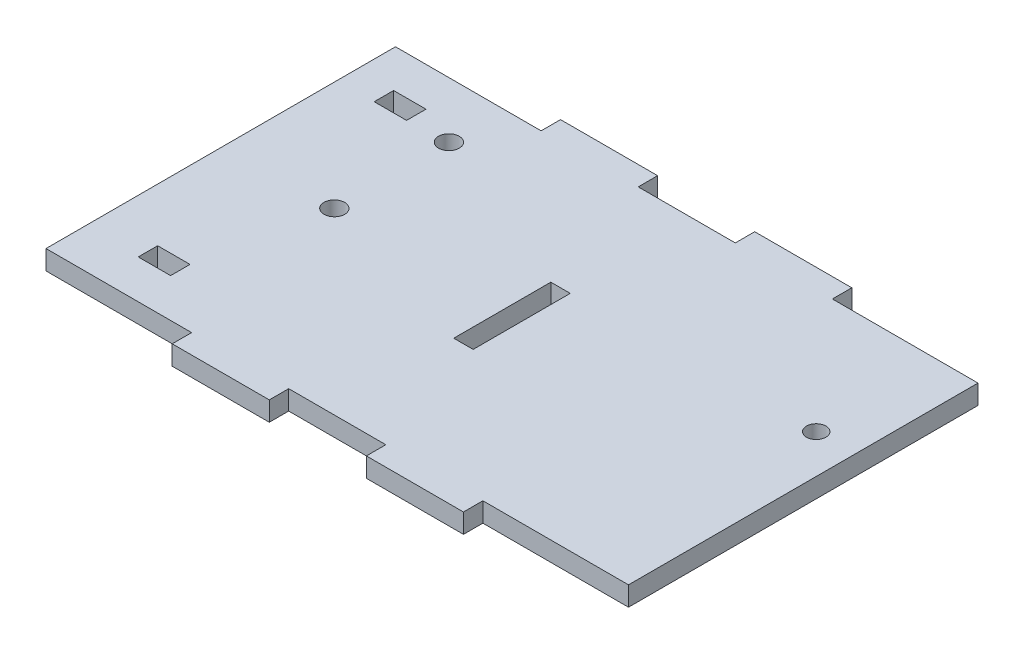
ISO-10303-21;
HEADER;
FILE_DESCRIPTION(('STEP AP214'),'2;1');
FILE_NAME('part.step','',(''),(''),'','','');
FILE_SCHEMA(('AUTOMOTIVE_DESIGN { 1 0 10303 214 1 1 1 1 }'));
ENDSEC;
DATA;
#1=APPLICATION_CONTEXT('core data for automotive mechanical design processes');
#2=APPLICATION_PROTOCOL_DEFINITION('international standard','automotive_design',2000,#1);
#3=PRODUCT_CONTEXT('',#1,'mechanical');
#4=PRODUCT('Part','Part','',(#3));
#5=PRODUCT_RELATED_PRODUCT_CATEGORY('part','',(#4));
#6=PRODUCT_DEFINITION_FORMATION('','',#4);
#7=PRODUCT_DEFINITION_CONTEXT('part definition',#1,'design');
#8=PRODUCT_DEFINITION('design','',#6,#7);
#9=PRODUCT_DEFINITION_SHAPE('','',#8);
#10=(LENGTH_UNIT() NAMED_UNIT(*) SI_UNIT(.MILLI.,.METRE.));
#11=(NAMED_UNIT(*) PLANE_ANGLE_UNIT() SI_UNIT($,.RADIAN.));
#12=(NAMED_UNIT(*) SI_UNIT($,.STERADIAN.) SOLID_ANGLE_UNIT());
#13=UNCERTAINTY_MEASURE_WITH_UNIT(LENGTH_MEASURE(1.E-05),#10,'distance_accuracy_value','');
#14=(GEOMETRIC_REPRESENTATION_CONTEXT(3) GLOBAL_UNCERTAINTY_ASSIGNED_CONTEXT((#13)) GLOBAL_UNIT_ASSIGNED_CONTEXT((#10,
#11,#12)) REPRESENTATION_CONTEXT('',''));
#15=CARTESIAN_POINT('',(0.,0.,0.));
#16=DIRECTION('',(0.,0.,1.));
#17=DIRECTION('',(1.,0.,0.));
#18=AXIS2_PLACEMENT_3D('',#15,#16,#17);
#19=CARTESIAN_POINT('',(-44.9999999999999,3.,27.0000000000001));
#20=DIRECTION('',(1.,0.,0.));
#21=DIRECTION('',(0.,0.,-1.));
#22=AXIS2_PLACEMENT_3D('',#19,#20,#21);
#23=PLANE('',#22);
#24=DIRECTION('',(0.,0.,1.));
#25=VECTOR('',#24,1.);
#26=CARTESIAN_POINT('',(-44.9999999999999,0.,27.0000000000001));
#27=LINE('',#26,#25);
#28=CARTESIAN_POINT('',(-44.9999999999999,0.,-27.));
#29=VERTEX_POINT('',#28);
#30=CARTESIAN_POINT('',(-44.9999999999999,0.,27.0000000000001));
#31=VERTEX_POINT('',#30);
#32=EDGE_CURVE('E338',#29,#31,#27,.T.);
#33=ORIENTED_EDGE('',*,*,#32,.T.);
#34=DIRECTION('',(0.,-1.,0.));
#35=VECTOR('',#34,1.);
#36=CARTESIAN_POINT('',(-44.9999999999999,3.,27.0000000000001));
#37=LINE('',#36,#35);
#38=CARTESIAN_POINT('',(-44.9999999999999,3.,27.0000000000001));
#39=VERTEX_POINT('',#38);
#40=EDGE_CURVE('E11',#39,#31,#37,.T.);
#41=ORIENTED_EDGE('',*,*,#40,.F.);
#42=DIRECTION('',(0.,0.,1.));
#43=VECTOR('',#42,1.);
#44=CARTESIAN_POINT('',(-44.9999999999999,3.,27.0000000000001));
#45=LINE('',#44,#43);
#46=CARTESIAN_POINT('',(-44.9999999999999,3.,-27.));
#47=VERTEX_POINT('',#46);
#48=EDGE_CURVE('E345',#47,#39,#45,.T.);
#49=ORIENTED_EDGE('',*,*,#48,.F.);
#50=DIRECTION('',(0.,-1.,0.));
#51=VECTOR('',#50,1.);
#52=CARTESIAN_POINT('',(-44.9999999999999,3.,-27.));
#53=LINE('',#52,#51);
#54=EDGE_CURVE('E387',#47,#29,#53,.T.);
#55=ORIENTED_EDGE('',*,*,#54,.T.);
#56=EDGE_LOOP('',(#33,#41,#49,#55));
#57=FACE_BOUND('',#56,.T.);
#58=ADVANCED_FACE('F32',(#57),#23,.F.);
#59=CARTESIAN_POINT('',(-22.5,3.,27.0000000000001));
#60=DIRECTION('',(0.,0.,-1.));
#61=DIRECTION('',(-1.,0.,0.));
#62=AXIS2_PLACEMENT_3D('',#59,#60,#61);
#63=PLANE('',#62);
#64=DIRECTION('',(1.,0.,0.));
#65=VECTOR('',#64,1.);
#66=CARTESIAN_POINT('',(-22.5,0.,27.0000000000001));
#67=LINE('',#66,#65);
#68=CARTESIAN_POINT('',(-22.5,0.,27.0000000000001));
#69=VERTEX_POINT('',#68);
#70=EDGE_CURVE('E390',#31,#69,#67,.T.);
#71=ORIENTED_EDGE('',*,*,#70,.T.);
#72=DIRECTION('',(0.,-1.,0.));
#73=VECTOR('',#72,1.);
#74=CARTESIAN_POINT('',(-22.5,3.,27.0000000000001));
#75=LINE('',#74,#73);
#76=CARTESIAN_POINT('',(-22.5,3.,27.0000000000001));
#77=VERTEX_POINT('',#76);
#78=EDGE_CURVE('E39',#77,#69,#75,.T.);
#79=ORIENTED_EDGE('',*,*,#78,.F.);
#80=DIRECTION('',(1.,0.,0.));
#81=VECTOR('',#80,1.);
#82=CARTESIAN_POINT('',(-22.5,3.,27.0000000000001));
#83=LINE('',#82,#81);
#84=EDGE_CURVE('E348',#39,#77,#83,.T.);
#85=ORIENTED_EDGE('',*,*,#84,.F.);
#86=ORIENTED_EDGE('',*,*,#40,.T.);
#87=EDGE_LOOP('',(#71,#79,#85,#86));
#88=FACE_BOUND('',#87,.T.);
#89=ADVANCED_FACE('F506',(#88),#63,.F.);
#90=CARTESIAN_POINT('',(-22.5,3.,30.0000000000002));
#91=DIRECTION('',(1.,0.,0.));
#92=DIRECTION('',(0.,0.,-1.));
#93=AXIS2_PLACEMENT_3D('',#90,#91,#92);
#94=PLANE('',#93);
#95=DIRECTION('',(0.,0.,1.));
#96=VECTOR('',#95,1.);
#97=CARTESIAN_POINT('',(-22.5,0.,30.0000000000002));
#98=LINE('',#97,#96);
#99=CARTESIAN_POINT('',(-22.5,0.,30.0000000000002));
#100=VERTEX_POINT('',#99);
#101=EDGE_CURVE('E392',#69,#100,#98,.T.);
#102=ORIENTED_EDGE('',*,*,#101,.T.);
#103=DIRECTION('',(0.,-1.,0.));
#104=VECTOR('',#103,1.);
#105=CARTESIAN_POINT('',(-22.5,3.,30.0000000000002));
#106=LINE('',#105,#104);
#107=CARTESIAN_POINT('',(-22.5,3.,30.0000000000002));
#108=VERTEX_POINT('',#107);
#109=EDGE_CURVE('E477',#108,#100,#106,.T.);
#110=ORIENTED_EDGE('',*,*,#109,.F.);
#111=DIRECTION('',(0.,0.,1.));
#112=VECTOR('',#111,1.);
#113=CARTESIAN_POINT('',(-22.5,3.,30.0000000000002));
#114=LINE('',#113,#112);
#115=EDGE_CURVE('E351',#77,#108,#114,.T.);
#116=ORIENTED_EDGE('',*,*,#115,.F.);
#117=ORIENTED_EDGE('',*,*,#78,.T.);
#118=EDGE_LOOP('',(#102,#110,#116,#117));
#119=FACE_BOUND('',#118,.T.);
#120=ADVANCED_FACE('F484',(#119),#94,.F.);
#121=CARTESIAN_POINT('',(-7.49999999999984,3.,30.0000000000001));
#122=DIRECTION('',(0.,0.,-1.));
#123=DIRECTION('',(-1.,0.,0.));
#124=AXIS2_PLACEMENT_3D('',#121,#122,#123);
#125=PLANE('',#124);
#126=DIRECTION('',(1.,0.,0.));
#127=VECTOR('',#126,1.);
#128=CARTESIAN_POINT('',(-7.49999999999984,0.,30.0000000000001));
#129=LINE('',#128,#127);
#130=CARTESIAN_POINT('',(-7.49999999999984,0.,30.0000000000001));
#131=VERTEX_POINT('',#130);
#132=EDGE_CURVE('E394',#100,#131,#129,.T.);
#133=ORIENTED_EDGE('',*,*,#132,.T.);
#134=DIRECTION('',(0.,-1.,0.));
#135=VECTOR('',#134,1.);
#136=CARTESIAN_POINT('',(-7.49999999999984,3.,30.0000000000001));
#137=LINE('',#136,#135);
#138=CARTESIAN_POINT('',(-7.49999999999984,3.,30.0000000000001));
#139=VERTEX_POINT('',#138);
#140=EDGE_CURVE('E474',#139,#131,#137,.T.);
#141=ORIENTED_EDGE('',*,*,#140,.F.);
#142=DIRECTION('',(1.,0.,0.));
#143=VECTOR('',#142,1.);
#144=CARTESIAN_POINT('',(-7.49999999999984,3.,30.0000000000001));
#145=LINE('',#144,#143);
#146=EDGE_CURVE('E353',#108,#139,#145,.T.);
#147=ORIENTED_EDGE('',*,*,#146,.F.);
#148=ORIENTED_EDGE('',*,*,#109,.T.);
#149=EDGE_LOOP('',(#133,#141,#147,#148));
#150=FACE_BOUND('',#149,.T.);
#151=ADVANCED_FACE('F494',(#150),#125,.F.);
#152=CARTESIAN_POINT('',(-7.49999999999984,3.,27.0000000000001));
#153=DIRECTION('',(-1.,0.,0.));
#154=DIRECTION('',(0.,0.,1.));
#155=AXIS2_PLACEMENT_3D('',#152,#153,#154);
#156=PLANE('',#155);
#157=DIRECTION('',(0.,0.,-1.));
#158=VECTOR('',#157,1.);
#159=CARTESIAN_POINT('',(-7.49999999999984,0.,27.0000000000001));
#160=LINE('',#159,#158);
#161=CARTESIAN_POINT('',(-7.49999999999984,0.,27.0000000000001));
#162=VERTEX_POINT('',#161);
#163=EDGE_CURVE('E396',#131,#162,#160,.T.);
#164=ORIENTED_EDGE('',*,*,#163,.T.);
#165=DIRECTION('',(0.,-1.,0.));
#166=VECTOR('',#165,1.);
#167=CARTESIAN_POINT('',(-7.49999999999984,3.,27.0000000000001));
#168=LINE('',#167,#166);
#169=CARTESIAN_POINT('',(-7.49999999999984,3.,27.0000000000001));
#170=VERTEX_POINT('',#169);
#171=EDGE_CURVE('E471',#170,#162,#168,.T.);
#172=ORIENTED_EDGE('',*,*,#171,.F.);
#173=DIRECTION('',(0.,0.,-1.));
#174=VECTOR('',#173,1.);
#175=CARTESIAN_POINT('',(-7.49999999999984,3.,27.0000000000001));
#176=LINE('',#175,#174);
#177=EDGE_CURVE('E355',#139,#170,#176,.T.);
#178=ORIENTED_EDGE('',*,*,#177,.F.);
#179=ORIENTED_EDGE('',*,*,#140,.T.);
#180=EDGE_LOOP('',(#164,#172,#178,#179));
#181=FACE_BOUND('',#180,.T.);
#182=ADVANCED_FACE('F498',(#181),#156,.F.);
#183=CARTESIAN_POINT('',(7.50000000000028,3.,27.));
#184=DIRECTION('',(0.,0.,-1.));
#185=DIRECTION('',(-1.,0.,0.));
#186=AXIS2_PLACEMENT_3D('',#183,#184,#185);
#187=PLANE('',#186);
#188=DIRECTION('',(1.,0.,0.));
#189=VECTOR('',#188,1.);
#190=CARTESIAN_POINT('',(7.50000000000028,0.,27.));
#191=LINE('',#190,#189);
#192=CARTESIAN_POINT('',(7.50000000000028,0.,27.));
#193=VERTEX_POINT('',#192);
#194=EDGE_CURVE('E398',#162,#193,#191,.T.);
#195=ORIENTED_EDGE('',*,*,#194,.T.);
#196=DIRECTION('',(0.,-1.,0.));
#197=VECTOR('',#196,1.);
#198=CARTESIAN_POINT('',(7.50000000000028,3.,27.));
#199=LINE('',#198,#197);
#200=CARTESIAN_POINT('',(7.50000000000028,3.,27.));
#201=VERTEX_POINT('',#200);
#202=EDGE_CURVE('E468',#201,#193,#199,.T.);
#203=ORIENTED_EDGE('',*,*,#202,.F.);
#204=DIRECTION('',(1.,0.,0.));
#205=VECTOR('',#204,1.);
#206=CARTESIAN_POINT('',(7.50000000000028,3.,27.));
#207=LINE('',#206,#205);
#208=EDGE_CURVE('E357',#170,#201,#207,.T.);
#209=ORIENTED_EDGE('',*,*,#208,.F.);
#210=ORIENTED_EDGE('',*,*,#171,.T.);
#211=EDGE_LOOP('',(#195,#203,#209,#210));
#212=FACE_BOUND('',#211,.T.);
#213=ADVANCED_FACE('F579',(#212),#187,.F.);
#214=CARTESIAN_POINT('',(7.50000000000028,3.,30.0000000000001));
#215=DIRECTION('',(1.,0.,0.));
#216=DIRECTION('',(0.,0.,-1.));
#217=AXIS2_PLACEMENT_3D('',#214,#215,#216);
#218=PLANE('',#217);
#219=DIRECTION('',(0.,0.,1.));
#220=VECTOR('',#219,1.);
#221=CARTESIAN_POINT('',(7.50000000000028,0.,30.0000000000001));
#222=LINE('',#221,#220);
#223=CARTESIAN_POINT('',(7.50000000000028,0.,30.0000000000001));
#224=VERTEX_POINT('',#223);
#225=EDGE_CURVE('E400',#193,#224,#222,.T.);
#226=ORIENTED_EDGE('',*,*,#225,.T.);
#227=DIRECTION('',(0.,-1.,0.));
#228=VECTOR('',#227,1.);
#229=CARTESIAN_POINT('',(7.50000000000028,3.,30.0000000000001));
#230=LINE('',#229,#228);
#231=CARTESIAN_POINT('',(7.50000000000028,3.,30.0000000000001));
#232=VERTEX_POINT('',#231);
#233=EDGE_CURVE('E465',#232,#224,#230,.T.);
#234=ORIENTED_EDGE('',*,*,#233,.F.);
#235=DIRECTION('',(0.,0.,1.));
#236=VECTOR('',#235,1.);
#237=CARTESIAN_POINT('',(7.50000000000028,3.,30.0000000000001));
#238=LINE('',#237,#236);
#239=EDGE_CURVE('E359',#201,#232,#238,.T.);
#240=ORIENTED_EDGE('',*,*,#239,.F.);
#241=ORIENTED_EDGE('',*,*,#202,.T.);
#242=EDGE_LOOP('',(#226,#234,#240,#241));
#243=FACE_BOUND('',#242,.T.);
#244=ADVANCED_FACE('F577',(#243),#218,.F.);
#245=CARTESIAN_POINT('',(22.5000000000002,3.,30.0000000000001));
#246=DIRECTION('',(0.,0.,-1.));
#247=DIRECTION('',(-1.,0.,0.));
#248=AXIS2_PLACEMENT_3D('',#245,#246,#247);
#249=PLANE('',#248);
#250=DIRECTION('',(1.,0.,0.));
#251=VECTOR('',#250,1.);
#252=CARTESIAN_POINT('',(22.5000000000002,0.,30.0000000000001));
#253=LINE('',#252,#251);
#254=CARTESIAN_POINT('',(22.5000000000002,0.,30.0000000000001));
#255=VERTEX_POINT('',#254);
#256=EDGE_CURVE('E402',#224,#255,#253,.T.);
#257=ORIENTED_EDGE('',*,*,#256,.T.);
#258=DIRECTION('',(0.,-1.,0.));
#259=VECTOR('',#258,1.);
#260=CARTESIAN_POINT('',(22.5000000000002,3.,30.0000000000001));
#261=LINE('',#260,#259);
#262=CARTESIAN_POINT('',(22.5000000000002,3.,30.0000000000001));
#263=VERTEX_POINT('',#262);
#264=EDGE_CURVE('E462',#263,#255,#261,.T.);
#265=ORIENTED_EDGE('',*,*,#264,.F.);
#266=DIRECTION('',(1.,0.,0.));
#267=VECTOR('',#266,1.);
#268=CARTESIAN_POINT('',(22.5000000000002,3.,30.0000000000001));
#269=LINE('',#268,#267);
#270=EDGE_CURVE('E361',#232,#263,#269,.T.);
#271=ORIENTED_EDGE('',*,*,#270,.F.);
#272=ORIENTED_EDGE('',*,*,#233,.T.);
#273=EDGE_LOOP('',(#257,#265,#271,#272));
#274=FACE_BOUND('',#273,.T.);
#275=ADVANCED_FACE('F572',(#274),#249,.F.);
#276=CARTESIAN_POINT('',(22.5000000000002,3.,27.0000000000001));
#277=DIRECTION('',(-1.,0.,0.));
#278=DIRECTION('',(0.,0.,1.));
#279=AXIS2_PLACEMENT_3D('',#276,#277,#278);
#280=PLANE('',#279);
#281=DIRECTION('',(0.,0.,-1.));
#282=VECTOR('',#281,1.);
#283=CARTESIAN_POINT('',(22.5000000000002,0.,27.0000000000001));
#284=LINE('',#283,#282);
#285=CARTESIAN_POINT('',(22.5000000000002,0.,27.0000000000001));
#286=VERTEX_POINT('',#285);
#287=EDGE_CURVE('E404',#255,#286,#284,.T.);
#288=ORIENTED_EDGE('',*,*,#287,.T.);
#289=DIRECTION('',(0.,-1.,0.));
#290=VECTOR('',#289,1.);
#291=CARTESIAN_POINT('',(22.5000000000002,3.,27.0000000000001));
#292=LINE('',#291,#290);
#293=CARTESIAN_POINT('',(22.5000000000002,3.,27.0000000000001));
#294=VERTEX_POINT('',#293);
#295=EDGE_CURVE('E459',#294,#286,#292,.T.);
#296=ORIENTED_EDGE('',*,*,#295,.F.);
#297=DIRECTION('',(0.,0.,-1.));
#298=VECTOR('',#297,1.);
#299=CARTESIAN_POINT('',(22.5000000000002,3.,27.0000000000001));
#300=LINE('',#299,#298);
#301=EDGE_CURVE('E363',#263,#294,#300,.T.);
#302=ORIENTED_EDGE('',*,*,#301,.F.);
#303=ORIENTED_EDGE('',*,*,#264,.T.);
#304=EDGE_LOOP('',(#288,#296,#302,#303));
#305=FACE_BOUND('',#304,.T.);
#306=ADVANCED_FACE('F567',(#305),#280,.F.);
#307=CARTESIAN_POINT('',(45.0000000000004,3.,27.));
#308=DIRECTION('',(0.,0.,-1.));
#309=DIRECTION('',(-1.,0.,0.));
#310=AXIS2_PLACEMENT_3D('',#307,#308,#309);
#311=PLANE('',#310);
#312=DIRECTION('',(1.,0.,0.));
#313=VECTOR('',#312,1.);
#314=CARTESIAN_POINT('',(45.0000000000004,0.,27.));
#315=LINE('',#314,#313);
#316=CARTESIAN_POINT('',(45.0000000000004,0.,27.));
#317=VERTEX_POINT('',#316);
#318=EDGE_CURVE('E406',#286,#317,#315,.T.);
#319=ORIENTED_EDGE('',*,*,#318,.T.);
#320=DIRECTION('',(0.,-1.,0.));
#321=VECTOR('',#320,1.);
#322=CARTESIAN_POINT('',(45.0000000000004,3.,27.));
#323=LINE('',#322,#321);
#324=CARTESIAN_POINT('',(45.0000000000004,3.,27.));
#325=VERTEX_POINT('',#324);
#326=EDGE_CURVE('E456',#325,#317,#323,.T.);
#327=ORIENTED_EDGE('',*,*,#326,.F.);
#328=DIRECTION('',(1.,0.,0.));
#329=VECTOR('',#328,1.);
#330=CARTESIAN_POINT('',(45.0000000000004,3.,27.));
#331=LINE('',#330,#329);
#332=EDGE_CURVE('E365',#294,#325,#331,.T.);
#333=ORIENTED_EDGE('',*,*,#332,.F.);
#334=ORIENTED_EDGE('',*,*,#295,.T.);
#335=EDGE_LOOP('',(#319,#327,#333,#334));
#336=FACE_BOUND('',#335,.T.);
#337=ADVANCED_FACE('F563',(#336),#311,.F.);
#338=CARTESIAN_POINT('',(44.9999999999997,3.,-27.0000000000001));
#339=DIRECTION('',(-1.,0.,0.));
#340=DIRECTION('',(0.,0.,1.));
#341=AXIS2_PLACEMENT_3D('',#338,#339,#340);
#342=PLANE('',#341);
#343=DIRECTION('',(0.,0.,-1.));
#344=VECTOR('',#343,1.);
#345=CARTESIAN_POINT('',(44.9999999999997,0.,-27.0000000000001));
#346=LINE('',#345,#344);
#347=CARTESIAN_POINT('',(44.9999999999997,0.,-27.0000000000001));
#348=VERTEX_POINT('',#347);
#349=EDGE_CURVE('E408',#317,#348,#346,.T.);
#350=ORIENTED_EDGE('',*,*,#349,.T.);
#351=DIRECTION('',(0.,-1.,0.));
#352=VECTOR('',#351,1.);
#353=CARTESIAN_POINT('',(44.9999999999997,3.,-27.0000000000001));
#354=LINE('',#353,#352);
#355=CARTESIAN_POINT('',(44.9999999999997,3.,-27.0000000000001));
#356=VERTEX_POINT('',#355);
#357=EDGE_CURVE('E453',#356,#348,#354,.T.);
#358=ORIENTED_EDGE('',*,*,#357,.F.);
#359=DIRECTION('',(0.,0.,-1.));
#360=VECTOR('',#359,1.);
#361=CARTESIAN_POINT('',(44.9999999999997,3.,-27.0000000000001));
#362=LINE('',#361,#360);
#363=EDGE_CURVE('E367',#325,#356,#362,.T.);
#364=ORIENTED_EDGE('',*,*,#363,.F.);
#365=ORIENTED_EDGE('',*,*,#326,.T.);
#366=EDGE_LOOP('',(#350,#358,#364,#365));
#367=FACE_BOUND('',#366,.T.);
#368=ADVANCED_FACE('F558',(#367),#342,.F.);
#369=CARTESIAN_POINT('',(22.5,3.,-27.0000000000001));
#370=DIRECTION('',(0.,0.,1.));
#371=DIRECTION('',(1.,0.,0.));
#372=AXIS2_PLACEMENT_3D('',#369,#370,#371);
#373=PLANE('',#372);
#374=DIRECTION('',(-1.,0.,0.));
#375=VECTOR('',#374,1.);
#376=CARTESIAN_POINT('',(22.5,0.,-27.0000000000001));
#377=LINE('',#376,#375);
#378=CARTESIAN_POINT('',(22.5,0.,-27.0000000000001));
#379=VERTEX_POINT('',#378);
#380=EDGE_CURVE('E410',#348,#379,#377,.T.);
#381=ORIENTED_EDGE('',*,*,#380,.T.);
#382=DIRECTION('',(0.,-1.,0.));
#383=VECTOR('',#382,1.);
#384=CARTESIAN_POINT('',(22.5,3.,-27.0000000000001));
#385=LINE('',#384,#383);
#386=CARTESIAN_POINT('',(22.5,3.,-27.0000000000001));
#387=VERTEX_POINT('',#386);
#388=EDGE_CURVE('E450',#387,#379,#385,.T.);
#389=ORIENTED_EDGE('',*,*,#388,.F.);
#390=DIRECTION('',(-1.,0.,0.));
#391=VECTOR('',#390,1.);
#392=CARTESIAN_POINT('',(22.5,3.,-27.0000000000001));
#393=LINE('',#392,#391);
#394=EDGE_CURVE('E369',#356,#387,#393,.T.);
#395=ORIENTED_EDGE('',*,*,#394,.F.);
#396=ORIENTED_EDGE('',*,*,#357,.T.);
#397=EDGE_LOOP('',(#381,#389,#395,#396));
#398=FACE_BOUND('',#397,.T.);
#399=ADVANCED_FACE('F552',(#398),#373,.F.);
#400=CARTESIAN_POINT('',(22.5,3.,-30.0000000000001));
#401=DIRECTION('',(-1.,0.,0.));
#402=DIRECTION('',(0.,0.,1.));
#403=AXIS2_PLACEMENT_3D('',#400,#401,#402);
#404=PLANE('',#403);
#405=DIRECTION('',(0.,0.,-1.));
#406=VECTOR('',#405,1.);
#407=CARTESIAN_POINT('',(22.5,0.,-30.0000000000001));
#408=LINE('',#407,#406);
#409=CARTESIAN_POINT('',(22.5,0.,-30.0000000000001));
#410=VERTEX_POINT('',#409);
#411=EDGE_CURVE('E412',#379,#410,#408,.T.);
#412=ORIENTED_EDGE('',*,*,#411,.T.);
#413=DIRECTION('',(0.,-1.,0.));
#414=VECTOR('',#413,1.);
#415=CARTESIAN_POINT('',(22.5,3.,-30.0000000000001));
#416=LINE('',#415,#414);
#417=CARTESIAN_POINT('',(22.5,3.,-30.0000000000001));
#418=VERTEX_POINT('',#417);
#419=EDGE_CURVE('E447',#418,#410,#416,.T.);
#420=ORIENTED_EDGE('',*,*,#419,.F.);
#421=DIRECTION('',(0.,0.,-1.));
#422=VECTOR('',#421,1.);
#423=CARTESIAN_POINT('',(22.5,3.,-30.0000000000001));
#424=LINE('',#423,#422);
#425=EDGE_CURVE('E371',#387,#418,#424,.T.);
#426=ORIENTED_EDGE('',*,*,#425,.F.);
#427=ORIENTED_EDGE('',*,*,#388,.T.);
#428=EDGE_LOOP('',(#412,#420,#426,#427));
#429=FACE_BOUND('',#428,.T.);
#430=ADVANCED_FACE('F548',(#429),#404,.F.);
#431=CARTESIAN_POINT('',(7.50000000000006,3.,-30.0000000000001));
#432=DIRECTION('',(0.,0.,1.));
#433=DIRECTION('',(1.,0.,0.));
#434=AXIS2_PLACEMENT_3D('',#431,#432,#433);
#435=PLANE('',#434);
#436=DIRECTION('',(-1.,0.,0.));
#437=VECTOR('',#436,1.);
#438=CARTESIAN_POINT('',(7.50000000000006,0.,-30.0000000000001));
#439=LINE('',#438,#437);
#440=CARTESIAN_POINT('',(7.50000000000006,0.,-30.0000000000001));
#441=VERTEX_POINT('',#440);
#442=EDGE_CURVE('E414',#410,#441,#439,.T.);
#443=ORIENTED_EDGE('',*,*,#442,.T.);
#444=DIRECTION('',(0.,-1.,0.));
#445=VECTOR('',#444,1.);
#446=CARTESIAN_POINT('',(7.50000000000006,3.,-30.0000000000001));
#447=LINE('',#446,#445);
#448=CARTESIAN_POINT('',(7.50000000000006,3.,-30.0000000000001));
#449=VERTEX_POINT('',#448);
#450=EDGE_CURVE('E444',#449,#441,#447,.T.);
#451=ORIENTED_EDGE('',*,*,#450,.F.);
#452=DIRECTION('',(-1.,0.,0.));
#453=VECTOR('',#452,1.);
#454=CARTESIAN_POINT('',(7.50000000000006,3.,-30.0000000000001));
#455=LINE('',#454,#453);
#456=EDGE_CURVE('E373',#418,#449,#455,.T.);
#457=ORIENTED_EDGE('',*,*,#456,.F.);
#458=ORIENTED_EDGE('',*,*,#419,.T.);
#459=EDGE_LOOP('',(#443,#451,#457,#458));
#460=FACE_BOUND('',#459,.T.);
#461=ADVANCED_FACE('F543',(#460),#435,.F.);
#462=CARTESIAN_POINT('',(7.50000000000006,3.,-27.0000000000001));
#463=DIRECTION('',(1.,0.,0.));
#464=DIRECTION('',(0.,0.,-1.));
#465=AXIS2_PLACEMENT_3D('',#462,#463,#464);
#466=PLANE('',#465);
#467=DIRECTION('',(0.,0.,1.));
#468=VECTOR('',#467,1.);
#469=CARTESIAN_POINT('',(7.50000000000006,0.,-27.0000000000001));
#470=LINE('',#469,#468);
#471=CARTESIAN_POINT('',(7.50000000000006,0.,-27.0000000000001));
#472=VERTEX_POINT('',#471);
#473=EDGE_CURVE('E416',#441,#472,#470,.T.);
#474=ORIENTED_EDGE('',*,*,#473,.T.);
#475=DIRECTION('',(0.,-1.,0.));
#476=VECTOR('',#475,1.);
#477=CARTESIAN_POINT('',(7.50000000000006,3.,-27.0000000000001));
#478=LINE('',#477,#476);
#479=CARTESIAN_POINT('',(7.50000000000006,3.,-27.0000000000001));
#480=VERTEX_POINT('',#479);
#481=EDGE_CURVE('E441',#480,#472,#478,.T.);
#482=ORIENTED_EDGE('',*,*,#481,.F.);
#483=DIRECTION('',(0.,0.,1.));
#484=VECTOR('',#483,1.);
#485=CARTESIAN_POINT('',(7.50000000000006,3.,-27.0000000000001));
#486=LINE('',#485,#484);
#487=EDGE_CURVE('E375',#449,#480,#486,.T.);
#488=ORIENTED_EDGE('',*,*,#487,.F.);
#489=ORIENTED_EDGE('',*,*,#450,.T.);
#490=EDGE_LOOP('',(#474,#482,#488,#489));
#491=FACE_BOUND('',#490,.T.);
#492=ADVANCED_FACE('F537',(#491),#466,.F.);
#493=CARTESIAN_POINT('',(-7.50000000000006,3.,-27.));
#494=DIRECTION('',(0.,0.,1.));
#495=DIRECTION('',(1.,0.,0.));
#496=AXIS2_PLACEMENT_3D('',#493,#494,#495);
#497=PLANE('',#496);
#498=DIRECTION('',(-1.,0.,0.));
#499=VECTOR('',#498,1.);
#500=CARTESIAN_POINT('',(-7.50000000000006,0.,-27.));
#501=LINE('',#500,#499);
#502=CARTESIAN_POINT('',(-7.50000000000006,0.,-27.));
#503=VERTEX_POINT('',#502);
#504=EDGE_CURVE('E418',#472,#503,#501,.T.);
#505=ORIENTED_EDGE('',*,*,#504,.T.);
#506=DIRECTION('',(0.,-1.,0.));
#507=VECTOR('',#506,1.);
#508=CARTESIAN_POINT('',(-7.50000000000006,3.,-27.));
#509=LINE('',#508,#507);
#510=CARTESIAN_POINT('',(-7.50000000000006,3.,-27.));
#511=VERTEX_POINT('',#510);
#512=EDGE_CURVE('E438',#511,#503,#509,.T.);
#513=ORIENTED_EDGE('',*,*,#512,.F.);
#514=DIRECTION('',(-1.,0.,0.));
#515=VECTOR('',#514,1.);
#516=CARTESIAN_POINT('',(-7.50000000000006,3.,-27.));
#517=LINE('',#516,#515);
#518=EDGE_CURVE('E377',#480,#511,#517,.T.);
#519=ORIENTED_EDGE('',*,*,#518,.F.);
#520=ORIENTED_EDGE('',*,*,#481,.T.);
#521=EDGE_LOOP('',(#505,#513,#519,#520));
#522=FACE_BOUND('',#521,.T.);
#523=ADVANCED_FACE('F533',(#522),#497,.F.);
#524=CARTESIAN_POINT('',(-7.50000000000006,3.,-30.));
#525=DIRECTION('',(-1.,0.,0.));
#526=DIRECTION('',(0.,0.,1.));
#527=AXIS2_PLACEMENT_3D('',#524,#525,#526);
#528=PLANE('',#527);
#529=DIRECTION('',(0.,0.,-1.));
#530=VECTOR('',#529,1.);
#531=CARTESIAN_POINT('',(-7.50000000000006,0.,-30.));
#532=LINE('',#531,#530);
#533=CARTESIAN_POINT('',(-7.50000000000006,0.,-30.));
#534=VERTEX_POINT('',#533);
#535=EDGE_CURVE('E420',#503,#534,#532,.T.);
#536=ORIENTED_EDGE('',*,*,#535,.T.);
#537=DIRECTION('',(0.,-1.,0.));
#538=VECTOR('',#537,1.);
#539=CARTESIAN_POINT('',(-7.50000000000006,3.,-30.));
#540=LINE('',#539,#538);
#541=CARTESIAN_POINT('',(-7.50000000000006,3.,-30.));
#542=VERTEX_POINT('',#541);
#543=EDGE_CURVE('E435',#542,#534,#540,.T.);
#544=ORIENTED_EDGE('',*,*,#543,.F.);
#545=DIRECTION('',(0.,0.,-1.));
#546=VECTOR('',#545,1.);
#547=CARTESIAN_POINT('',(-7.50000000000006,3.,-30.));
#548=LINE('',#547,#546);
#549=EDGE_CURVE('E379',#511,#542,#548,.T.);
#550=ORIENTED_EDGE('',*,*,#549,.F.);
#551=ORIENTED_EDGE('',*,*,#512,.T.);
#552=EDGE_LOOP('',(#536,#544,#550,#551));
#553=FACE_BOUND('',#552,.T.);
#554=ADVANCED_FACE('F528',(#553),#528,.F.);
#555=CARTESIAN_POINT('',(-22.4999999999997,3.,-30.));
#556=DIRECTION('',(0.,0.,1.));
#557=DIRECTION('',(1.,0.,0.));
#558=AXIS2_PLACEMENT_3D('',#555,#556,#557);
#559=PLANE('',#558);
#560=DIRECTION('',(-1.,0.,0.));
#561=VECTOR('',#560,1.);
#562=CARTESIAN_POINT('',(-22.4999999999997,0.,-30.));
#563=LINE('',#562,#561);
#564=CARTESIAN_POINT('',(-22.4999999999997,0.,-30.));
#565=VERTEX_POINT('',#564);
#566=EDGE_CURVE('E422',#534,#565,#563,.T.);
#567=ORIENTED_EDGE('',*,*,#566,.T.);
#568=DIRECTION('',(0.,-1.,0.));
#569=VECTOR('',#568,1.);
#570=CARTESIAN_POINT('',(-22.4999999999997,3.,-30.));
#571=LINE('',#570,#569);
#572=CARTESIAN_POINT('',(-22.4999999999997,3.,-30.));
#573=VERTEX_POINT('',#572);
#574=EDGE_CURVE('E432',#573,#565,#571,.T.);
#575=ORIENTED_EDGE('',*,*,#574,.F.);
#576=DIRECTION('',(-1.,0.,0.));
#577=VECTOR('',#576,1.);
#578=CARTESIAN_POINT('',(-22.4999999999997,3.,-30.));
#579=LINE('',#578,#577);
#580=EDGE_CURVE('E381',#542,#573,#579,.T.);
#581=ORIENTED_EDGE('',*,*,#580,.F.);
#582=ORIENTED_EDGE('',*,*,#543,.T.);
#583=EDGE_LOOP('',(#567,#575,#581,#582));
#584=FACE_BOUND('',#583,.T.);
#585=ADVANCED_FACE('F522',(#584),#559,.F.);
#586=CARTESIAN_POINT('',(-22.4999999999997,3.,-27.));
#587=DIRECTION('',(1.,0.,0.));
#588=DIRECTION('',(0.,0.,-1.));
#589=AXIS2_PLACEMENT_3D('',#586,#587,#588);
#590=PLANE('',#589);
#591=DIRECTION('',(0.,0.,1.));
#592=VECTOR('',#591,1.);
#593=CARTESIAN_POINT('',(-22.4999999999997,0.,-27.));
#594=LINE('',#593,#592);
#595=CARTESIAN_POINT('',(-22.4999999999997,0.,-27.));
#596=VERTEX_POINT('',#595);
#597=EDGE_CURVE('E424',#565,#596,#594,.T.);
#598=ORIENTED_EDGE('',*,*,#597,.T.);
#599=DIRECTION('',(0.,-1.,0.));
#600=VECTOR('',#599,1.);
#601=CARTESIAN_POINT('',(-22.4999999999997,3.,-27.));
#602=LINE('',#601,#600);
#603=CARTESIAN_POINT('',(-22.4999999999997,3.,-27.));
#604=VERTEX_POINT('',#603);
#605=EDGE_CURVE('E429',#604,#596,#602,.T.);
#606=ORIENTED_EDGE('',*,*,#605,.F.);
#607=DIRECTION('',(0.,0.,1.));
#608=VECTOR('',#607,1.);
#609=CARTESIAN_POINT('',(-22.4999999999997,3.,-27.));
#610=LINE('',#609,#608);
#611=EDGE_CURVE('E383',#573,#604,#610,.T.);
#612=ORIENTED_EDGE('',*,*,#611,.F.);
#613=ORIENTED_EDGE('',*,*,#574,.T.);
#614=EDGE_LOOP('',(#598,#606,#612,#613));
#615=FACE_BOUND('',#614,.T.);
#616=ADVANCED_FACE('F518',(#615),#590,.F.);
#617=CARTESIAN_POINT('',(-44.9999999999999,3.,-27.));
#618=DIRECTION('',(0.,0.,1.));
#619=DIRECTION('',(1.,0.,0.));
#620=AXIS2_PLACEMENT_3D('',#617,#618,#619);
#621=PLANE('',#620);
#622=DIRECTION('',(-1.,0.,0.));
#623=VECTOR('',#622,1.);
#624=CARTESIAN_POINT('',(-44.9999999999999,0.,-27.));
#625=LINE('',#624,#623);
#626=EDGE_CURVE('E349',#596,#29,#625,.T.);
#627=ORIENTED_EDGE('',*,*,#626,.T.);
#628=ORIENTED_EDGE('',*,*,#54,.F.);
#629=DIRECTION('',(-1.,0.,0.));
#630=VECTOR('',#629,1.);
#631=CARTESIAN_POINT('',(-44.9999999999999,3.,-27.));
#632=LINE('',#631,#630);
#633=EDGE_CURVE('E385',#604,#47,#632,.T.);
#634=ORIENTED_EDGE('',*,*,#633,.F.);
#635=ORIENTED_EDGE('',*,*,#605,.T.);
#636=EDGE_LOOP('',(#627,#628,#634,#635));
#637=FACE_BOUND('',#636,.T.);
#638=ADVANCED_FACE('F513',(#637),#621,.F.);
#639=CARTESIAN_POINT('',(0.,3.,0.));
#640=DIRECTION('',(0.,-1.,0.));
#641=DIRECTION('',(0.,0.,-1.));
#642=AXIS2_PLACEMENT_3D('',#639,#640,#641);
#643=PLANE('',#642);
#644=CARTESIAN_POINT('',(-28.1,3.,-0.64999999999998));
#645=DIRECTION('',(0.,1.,0.));
#646=DIRECTION('',(0.,0.,1.));
#647=AXIS2_PLACEMENT_3D('',#644,#645,#646);
#648=CIRCLE('',#647,1.6);
#649=CARTESIAN_POINT('',(-28.1,3.,0.950000000000025));
#650=VERTEX_POINT('',#649);
#651=EDGE_CURVE('E893',#650,#650,#648,.T.);
#652=ORIENTED_EDGE('',*,*,#651,.F.);
#653=EDGE_LOOP('',(#652));
#654=FACE_BOUND('',#653,.T.);
#655=CARTESIAN_POINT('',(-28.1,3.,-18.35));
#656=DIRECTION('',(0.,1.,0.));
#657=DIRECTION('',(0.,0.,1.));
#658=AXIS2_PLACEMENT_3D('',#655,#656,#657);
#659=CIRCLE('',#658,1.6);
#660=CARTESIAN_POINT('',(-28.1,3.,-16.75));
#661=VERTEX_POINT('',#660);
#662=EDGE_CURVE('E895',#661,#661,#659,.T.);
#663=ORIENTED_EDGE('',*,*,#662,.F.);
#664=EDGE_LOOP('',(#663));
#665=FACE_BOUND('',#664,.T.);
#666=CARTESIAN_POINT('',(38.9999999999999,3.,-8.00000000000005));
#667=DIRECTION('',(0.,1.,0.));
#668=DIRECTION('',(0.,0.,1.));
#669=AXIS2_PLACEMENT_3D('',#666,#667,#668);
#670=CIRCLE('',#669,1.5);
#671=CARTESIAN_POINT('',(38.9999999999999,3.,-6.50000000000004));
#672=VERTEX_POINT('',#671);
#673=EDGE_CURVE('E264',#672,#672,#670,.T.);
#674=ORIENTED_EDGE('',*,*,#673,.F.);
#675=EDGE_LOOP('',(#674));
#676=FACE_BOUND('',#675,.T.);
#677=DIRECTION('',(1.,0.,0.));
#678=VECTOR('',#677,1.);
#679=CARTESIAN_POINT('',(-1.50000000000006,3.,7.50000000000004));
#680=LINE('',#679,#678);
#681=CARTESIAN_POINT('',(-1.50000000000006,3.,7.50000000000004));
#682=VERTEX_POINT('',#681);
#683=CARTESIAN_POINT('',(1.49999999999983,3.,7.50000000000002));
#684=VERTEX_POINT('',#683);
#685=EDGE_CURVE('E270',#682,#684,#680,.T.);
#686=ORIENTED_EDGE('',*,*,#685,.F.);
#687=DIRECTION('',(0.,0.,1.));
#688=VECTOR('',#687,1.);
#689=CARTESIAN_POINT('',(-1.50000000000006,3.,-7.50000000000002));
#690=LINE('',#689,#688);
#691=CARTESIAN_POINT('',(-1.50000000000006,3.,-7.50000000000002));
#692=VERTEX_POINT('',#691);
#693=EDGE_CURVE('E46',#692,#682,#690,.T.);
#694=ORIENTED_EDGE('',*,*,#693,.F.);
#695=DIRECTION('',(-1.,0.,0.));
#696=VECTOR('',#695,1.);
#697=CARTESIAN_POINT('',(-1.50000000000006,3.,-7.50000000000002));
#698=LINE('',#697,#696);
#699=CARTESIAN_POINT('',(1.49999999999983,3.,-7.50000000000002));
#700=VERTEX_POINT('',#699);
#701=EDGE_CURVE('E258',#700,#692,#698,.T.);
#702=ORIENTED_EDGE('',*,*,#701,.F.);
#703=DIRECTION('',(0.,0.,-1.));
#704=VECTOR('',#703,1.);
#705=CARTESIAN_POINT('',(1.49999999999983,3.,-7.50000000000002));
#706=LINE('',#705,#704);
#707=EDGE_CURVE('E261',#684,#700,#706,.T.);
#708=ORIENTED_EDGE('',*,*,#707,.F.);
#709=EDGE_LOOP('',(#686,#694,#702,#708));
#710=FACE_BOUND('',#709,.T.);
#711=DIRECTION('',(-1.,0.,0.));
#712=VECTOR('',#711,1.);
#713=CARTESIAN_POINT('',(-34.2900000000002,3.,-21.));
#714=LINE('',#713,#712);
#715=CARTESIAN_POINT('',(-34.2900000000002,3.,-21.));
#716=VERTEX_POINT('',#715);
#717=CARTESIAN_POINT('',(-39.29,3.,-21.));
#718=VERTEX_POINT('',#717);
#719=EDGE_CURVE('E296',#716,#718,#714,.T.);
#720=ORIENTED_EDGE('',*,*,#719,.F.);
#721=DIRECTION('',(0.,0.,-1.));
#722=VECTOR('',#721,1.);
#723=CARTESIAN_POINT('',(-34.2900000000002,3.,-18.));
#724=LINE('',#723,#722);
#725=CARTESIAN_POINT('',(-34.2900000000002,3.,-18.));
#726=VERTEX_POINT('',#725);
#727=EDGE_CURVE('E277',#726,#716,#724,.T.);
#728=ORIENTED_EDGE('',*,*,#727,.F.);
#729=DIRECTION('',(1.,0.,0.));
#730=VECTOR('',#729,1.);
#731=CARTESIAN_POINT('',(-34.2900000000002,3.,-18.));
#732=LINE('',#731,#730);
#733=CARTESIAN_POINT('',(-39.29,3.,-18.));
#734=VERTEX_POINT('',#733);
#735=EDGE_CURVE('E285',#734,#726,#732,.T.);
#736=ORIENTED_EDGE('',*,*,#735,.F.);
#737=DIRECTION('',(0.,0.,1.));
#738=VECTOR('',#737,1.);
#739=CARTESIAN_POINT('',(-39.29,3.,-18.));
#740=LINE('',#739,#738);
#741=EDGE_CURVE('E299',#718,#734,#740,.T.);
#742=ORIENTED_EDGE('',*,*,#741,.F.);
#743=EDGE_LOOP('',(#720,#728,#736,#742));
#744=FACE_BOUND('',#743,.T.);
#745=DIRECTION('',(1.,0.,0.));
#746=VECTOR('',#745,1.);
#747=CARTESIAN_POINT('',(-36.7499999999998,3.,21.0000000000001));
#748=LINE('',#747,#746);
#749=CARTESIAN_POINT('',(-36.7499999999998,3.,21.0000000000001));
#750=VERTEX_POINT('',#749);
#751=CARTESIAN_POINT('',(-31.7499999999997,3.,21.0000000000001));
#752=VERTEX_POINT('',#751);
#753=EDGE_CURVE('E328',#750,#752,#748,.T.);
#754=ORIENTED_EDGE('',*,*,#753,.F.);
#755=DIRECTION('',(0.,0.,1.));
#756=VECTOR('',#755,1.);
#757=CARTESIAN_POINT('',(-36.7500000000001,3.,18.0000000000001));
#758=LINE('',#757,#756);
#759=CARTESIAN_POINT('',(-36.7500000000001,3.,18.0000000000001));
#760=VERTEX_POINT('',#759);
#761=EDGE_CURVE('E306',#760,#750,#758,.T.);
#762=ORIENTED_EDGE('',*,*,#761,.F.);
#763=DIRECTION('',(-1.,0.,0.));
#764=VECTOR('',#763,1.);
#765=CARTESIAN_POINT('',(-36.7500000000001,3.,18.0000000000001));
#766=LINE('',#765,#764);
#767=CARTESIAN_POINT('',(-31.7500000000002,3.,18.0000000000001));
#768=VERTEX_POINT('',#767);
#769=EDGE_CURVE('E317',#768,#760,#766,.T.);
#770=ORIENTED_EDGE('',*,*,#769,.F.);
#771=DIRECTION('',(0.,0.,-1.));
#772=VECTOR('',#771,1.);
#773=CARTESIAN_POINT('',(-31.7500000000002,3.,18.0000000000001));
#774=LINE('',#773,#772);
#775=EDGE_CURVE('E331',#752,#768,#774,.T.);
#776=ORIENTED_EDGE('',*,*,#775,.F.);
#777=EDGE_LOOP('',(#754,#762,#770,#776));
#778=FACE_BOUND('',#777,.T.);
#779=ORIENTED_EDGE('',*,*,#48,.T.);
#780=ORIENTED_EDGE('',*,*,#84,.T.);
#781=ORIENTED_EDGE('',*,*,#115,.T.);
#782=ORIENTED_EDGE('',*,*,#146,.T.);
#783=ORIENTED_EDGE('',*,*,#177,.T.);
#784=ORIENTED_EDGE('',*,*,#208,.T.);
#785=ORIENTED_EDGE('',*,*,#239,.T.);
#786=ORIENTED_EDGE('',*,*,#270,.T.);
#787=ORIENTED_EDGE('',*,*,#301,.T.);
#788=ORIENTED_EDGE('',*,*,#332,.T.);
#789=ORIENTED_EDGE('',*,*,#363,.T.);
#790=ORIENTED_EDGE('',*,*,#394,.T.);
#791=ORIENTED_EDGE('',*,*,#425,.T.);
#792=ORIENTED_EDGE('',*,*,#456,.T.);
#793=ORIENTED_EDGE('',*,*,#487,.T.);
#794=ORIENTED_EDGE('',*,*,#518,.T.);
#795=ORIENTED_EDGE('',*,*,#549,.T.);
#796=ORIENTED_EDGE('',*,*,#580,.T.);
#797=ORIENTED_EDGE('',*,*,#611,.T.);
#798=ORIENTED_EDGE('',*,*,#633,.T.);
#799=EDGE_LOOP('',(#779,#780,#781,#782,#783,#784,#785,#786,#787,#788,#789,#790,#791,#792,#793,
#794,#795,#796,#797,#798));
#800=FACE_BOUND('',#799,.T.);
#801=ADVANCED_FACE('F502',(#654,#665,#676,#710,#744,#778,#800),#643,.F.);
#802=CARTESIAN_POINT('',(0.,0.,0.));
#803=DIRECTION('',(0.,-1.,0.));
#804=DIRECTION('',(0.,0.,-1.));
#805=AXIS2_PLACEMENT_3D('',#802,#803,#804);
#806=PLANE('',#805);
#807=CARTESIAN_POINT('',(-28.1,0.,-0.64999999999998));
#808=DIRECTION('',(0.,1.,0.));
#809=DIRECTION('',(0.,0.,1.));
#810=AXIS2_PLACEMENT_3D('',#807,#808,#809);
#811=CIRCLE('',#810,1.6);
#812=CARTESIAN_POINT('',(-28.1,0.,0.950000000000025));
#813=VERTEX_POINT('',#812);
#814=EDGE_CURVE('E890',#813,#813,#811,.T.);
#815=ORIENTED_EDGE('',*,*,#814,.T.);
#816=EDGE_LOOP('',(#815));
#817=FACE_BOUND('',#816,.T.);
#818=CARTESIAN_POINT('',(-28.1,0.,-18.35));
#819=DIRECTION('',(0.,1.,0.));
#820=DIRECTION('',(0.,0.,1.));
#821=AXIS2_PLACEMENT_3D('',#818,#819,#820);
#822=CIRCLE('',#821,1.6);
#823=CARTESIAN_POINT('',(-28.1,0.,-16.75));
#824=VERTEX_POINT('',#823);
#825=EDGE_CURVE('E898',#824,#824,#822,.T.);
#826=ORIENTED_EDGE('',*,*,#825,.T.);
#827=EDGE_LOOP('',(#826));
#828=FACE_BOUND('',#827,.T.);
#829=CARTESIAN_POINT('',(38.9999999999999,0.,-8.00000000000005));
#830=DIRECTION('',(0.,1.,0.));
#831=DIRECTION('',(0.,0.,1.));
#832=AXIS2_PLACEMENT_3D('',#829,#830,#831);
#833=CIRCLE('',#832,1.5);
#834=CARTESIAN_POINT('',(38.9999999999999,0.,-6.50000000000004));
#835=VERTEX_POINT('',#834);
#836=EDGE_CURVE('E271',#835,#835,#833,.T.);
#837=ORIENTED_EDGE('',*,*,#836,.T.);
#838=EDGE_LOOP('',(#837));
#839=FACE_BOUND('',#838,.T.);
#840=DIRECTION('',(0.,0.,1.));
#841=VECTOR('',#840,1.);
#842=CARTESIAN_POINT('',(-1.50000000000006,0.,-7.50000000000002));
#843=LINE('',#842,#841);
#844=CARTESIAN_POINT('',(-1.50000000000006,0.,-7.50000000000002));
#845=VERTEX_POINT('',#844);
#846=CARTESIAN_POINT('',(-1.50000000000006,0.,7.50000000000004));
#847=VERTEX_POINT('',#846);
#848=EDGE_CURVE('E242',#845,#847,#843,.T.);
#849=ORIENTED_EDGE('',*,*,#848,.T.);
#850=DIRECTION('',(1.,0.,0.));
#851=VECTOR('',#850,1.);
#852=CARTESIAN_POINT('',(-1.50000000000006,0.,7.50000000000004));
#853=LINE('',#852,#851);
#854=CARTESIAN_POINT('',(1.49999999999983,0.,7.50000000000002));
#855=VERTEX_POINT('',#854);
#856=EDGE_CURVE('E251',#847,#855,#853,.T.);
#857=ORIENTED_EDGE('',*,*,#856,.T.);
#858=DIRECTION('',(0.,0.,-1.));
#859=VECTOR('',#858,1.);
#860=CARTESIAN_POINT('',(1.49999999999983,0.,-7.50000000000002));
#861=LINE('',#860,#859);
#862=CARTESIAN_POINT('',(1.49999999999983,0.,-7.50000000000002));
#863=VERTEX_POINT('',#862);
#864=EDGE_CURVE('E54',#855,#863,#861,.T.);
#865=ORIENTED_EDGE('',*,*,#864,.T.);
#866=DIRECTION('',(-1.,0.,0.));
#867=VECTOR('',#866,1.);
#868=CARTESIAN_POINT('',(-1.50000000000006,0.,-7.50000000000002));
#869=LINE('',#868,#867);
#870=EDGE_CURVE('E248',#863,#845,#869,.T.);
#871=ORIENTED_EDGE('',*,*,#870,.T.);
#872=EDGE_LOOP('',(#849,#857,#865,#871));
#873=FACE_BOUND('',#872,.T.);
#874=DIRECTION('',(0.,0.,-1.));
#875=VECTOR('',#874,1.);
#876=CARTESIAN_POINT('',(-34.2900000000002,0.,-18.));
#877=LINE('',#876,#875);
#878=CARTESIAN_POINT('',(-34.2900000000002,0.,-18.));
#879=VERTEX_POINT('',#878);
#880=CARTESIAN_POINT('',(-34.2900000000002,0.,-21.));
#881=VERTEX_POINT('',#880);
#882=EDGE_CURVE('E281',#879,#881,#877,.T.);
#883=ORIENTED_EDGE('',*,*,#882,.T.);
#884=DIRECTION('',(-1.,0.,0.));
#885=VECTOR('',#884,1.);
#886=CARTESIAN_POINT('',(-34.2900000000002,0.,-21.));
#887=LINE('',#886,#885);
#888=CARTESIAN_POINT('',(-39.29,0.,-21.));
#889=VERTEX_POINT('',#888);
#890=EDGE_CURVE('E284',#881,#889,#887,.T.);
#891=ORIENTED_EDGE('',*,*,#890,.T.);
#892=DIRECTION('',(0.,0.,1.));
#893=VECTOR('',#892,1.);
#894=CARTESIAN_POINT('',(-39.29,0.,-18.));
#895=LINE('',#894,#893);
#896=CARTESIAN_POINT('',(-39.29,0.,-18.));
#897=VERTEX_POINT('',#896);
#898=EDGE_CURVE('E288',#889,#897,#895,.T.);
#899=ORIENTED_EDGE('',*,*,#898,.T.);
#900=DIRECTION('',(1.,0.,0.));
#901=VECTOR('',#900,1.);
#902=CARTESIAN_POINT('',(-34.2900000000002,0.,-18.));
#903=LINE('',#902,#901);
#904=EDGE_CURVE('E291',#897,#879,#903,.T.);
#905=ORIENTED_EDGE('',*,*,#904,.T.);
#906=EDGE_LOOP('',(#883,#891,#899,#905));
#907=FACE_BOUND('',#906,.T.);
#908=DIRECTION('',(0.,0.,1.));
#909=VECTOR('',#908,1.);
#910=CARTESIAN_POINT('',(-36.7500000000001,0.,18.0000000000001));
#911=LINE('',#910,#909);
#912=CARTESIAN_POINT('',(-36.7500000000001,0.,18.0000000000001));
#913=VERTEX_POINT('',#912);
#914=CARTESIAN_POINT('',(-36.7499999999998,0.,21.0000000000001));
#915=VERTEX_POINT('',#914);
#916=EDGE_CURVE('E313',#913,#915,#911,.T.);
#917=ORIENTED_EDGE('',*,*,#916,.T.);
#918=DIRECTION('',(1.,0.,0.));
#919=VECTOR('',#918,1.);
#920=CARTESIAN_POINT('',(-36.7499999999998,0.,21.0000000000001));
#921=LINE('',#920,#919);
#922=CARTESIAN_POINT('',(-31.7499999999997,0.,21.0000000000001));
#923=VERTEX_POINT('',#922);
#924=EDGE_CURVE('E316',#915,#923,#921,.T.);
#925=ORIENTED_EDGE('',*,*,#924,.T.);
#926=DIRECTION('',(0.,0.,-1.));
#927=VECTOR('',#926,1.);
#928=CARTESIAN_POINT('',(-31.7500000000002,0.,18.0000000000001));
#929=LINE('',#928,#927);
#930=CARTESIAN_POINT('',(-31.7500000000002,0.,18.0000000000001));
#931=VERTEX_POINT('',#930);
#932=EDGE_CURVE('E320',#923,#931,#929,.T.);
#933=ORIENTED_EDGE('',*,*,#932,.T.);
#934=DIRECTION('',(-1.,0.,0.));
#935=VECTOR('',#934,1.);
#936=CARTESIAN_POINT('',(-36.7500000000001,0.,18.0000000000001));
#937=LINE('',#936,#935);
#938=EDGE_CURVE('E323',#931,#913,#937,.T.);
#939=ORIENTED_EDGE('',*,*,#938,.T.);
#940=EDGE_LOOP('',(#917,#925,#933,#939));
#941=FACE_BOUND('',#940,.T.);
#942=ORIENTED_EDGE('',*,*,#32,.F.);
#943=ORIENTED_EDGE('',*,*,#626,.F.);
#944=ORIENTED_EDGE('',*,*,#597,.F.);
#945=ORIENTED_EDGE('',*,*,#566,.F.);
#946=ORIENTED_EDGE('',*,*,#535,.F.);
#947=ORIENTED_EDGE('',*,*,#504,.F.);
#948=ORIENTED_EDGE('',*,*,#473,.F.);
#949=ORIENTED_EDGE('',*,*,#442,.F.);
#950=ORIENTED_EDGE('',*,*,#411,.F.);
#951=ORIENTED_EDGE('',*,*,#380,.F.);
#952=ORIENTED_EDGE('',*,*,#349,.F.);
#953=ORIENTED_EDGE('',*,*,#318,.F.);
#954=ORIENTED_EDGE('',*,*,#287,.F.);
#955=ORIENTED_EDGE('',*,*,#256,.F.);
#956=ORIENTED_EDGE('',*,*,#225,.F.);
#957=ORIENTED_EDGE('',*,*,#194,.F.);
#958=ORIENTED_EDGE('',*,*,#163,.F.);
#959=ORIENTED_EDGE('',*,*,#132,.F.);
#960=ORIENTED_EDGE('',*,*,#101,.F.);
#961=ORIENTED_EDGE('',*,*,#70,.F.);
#962=EDGE_LOOP('',(#942,#943,#944,#945,#946,#947,#948,#949,#950,#951,#952,#953,#954,#955,#956,
#957,#958,#959,#960,#961));
#963=FACE_BOUND('',#962,.T.);
#964=ADVANCED_FACE('F255',(#817,#828,#839,#873,#907,#941,#963),#806,.T.);
#965=CARTESIAN_POINT('',(-36.7500000000001,0.,18.0000000000001));
#966=DIRECTION('',(-1.,0.,0.));
#967=DIRECTION('',(0.,0.,1.));
#968=AXIS2_PLACEMENT_3D('',#965,#966,#967);
#969=PLANE('',#968);
#970=ORIENTED_EDGE('',*,*,#761,.T.);
#971=DIRECTION('',(0.,1.,0.));
#972=VECTOR('',#971,1.);
#973=CARTESIAN_POINT('',(-36.7499999999998,0.,21.0000000000001));
#974=LINE('',#973,#972);
#975=EDGE_CURVE('E326',#915,#750,#974,.T.);
#976=ORIENTED_EDGE('',*,*,#975,.F.);
#977=ORIENTED_EDGE('',*,*,#916,.F.);
#978=DIRECTION('',(0.,1.,0.));
#979=VECTOR('',#978,1.);
#980=CARTESIAN_POINT('',(-36.7500000000001,0.,18.0000000000001));
#981=LINE('',#980,#979);
#982=EDGE_CURVE('E336',#913,#760,#981,.T.);
#983=ORIENTED_EDGE('',*,*,#982,.T.);
#984=EDGE_LOOP('',(#970,#976,#977,#983));
#985=FACE_BOUND('',#984,.T.);
#986=ADVANCED_FACE('F738',(#985),#969,.F.);
#987=CARTESIAN_POINT('',(-36.7500000000001,0.,18.0000000000001));
#988=DIRECTION('',(0.,0.,-1.));
#989=DIRECTION('',(-1.,0.,0.));
#990=AXIS2_PLACEMENT_3D('',#987,#988,#989);
#991=PLANE('',#990);
#992=ORIENTED_EDGE('',*,*,#769,.T.);
#993=ORIENTED_EDGE('',*,*,#982,.F.);
#994=ORIENTED_EDGE('',*,*,#938,.F.);
#995=DIRECTION('',(0.,1.,0.));
#996=VECTOR('',#995,1.);
#997=CARTESIAN_POINT('',(-31.7500000000002,0.,18.0000000000001));
#998=LINE('',#997,#996);
#999=EDGE_CURVE('E339',#931,#768,#998,.T.);
#1000=ORIENTED_EDGE('',*,*,#999,.T.);
#1001=EDGE_LOOP('',(#992,#993,#994,#1000));
#1002=FACE_BOUND('',#1001,.T.);
#1003=ADVANCED_FACE('F748',(#1002),#991,.F.);
#1004=CARTESIAN_POINT('',(-31.7500000000002,0.,18.0000000000001));
#1005=DIRECTION('',(1.,0.,0.));
#1006=DIRECTION('',(0.,0.,-1.));
#1007=AXIS2_PLACEMENT_3D('',#1004,#1005,#1006);
#1008=PLANE('',#1007);
#1009=ORIENTED_EDGE('',*,*,#775,.T.);
#1010=ORIENTED_EDGE('',*,*,#999,.F.);
#1011=ORIENTED_EDGE('',*,*,#932,.F.);
#1012=DIRECTION('',(0.,1.,0.));
#1013=VECTOR('',#1012,1.);
#1014=CARTESIAN_POINT('',(-31.7499999999997,0.,21.0000000000001));
#1015=LINE('',#1014,#1013);
#1016=EDGE_CURVE('E341',#923,#752,#1015,.T.);
#1017=ORIENTED_EDGE('',*,*,#1016,.T.);
#1018=EDGE_LOOP('',(#1009,#1010,#1011,#1017));
#1019=FACE_BOUND('',#1018,.T.);
#1020=ADVANCED_FACE('F758',(#1019),#1008,.F.);
#1021=CARTESIAN_POINT('',(-36.7499999999998,0.,21.0000000000001));
#1022=DIRECTION('',(0.,0.,1.));
#1023=DIRECTION('',(1.,0.,0.));
#1024=AXIS2_PLACEMENT_3D('',#1021,#1022,#1023);
#1025=PLANE('',#1024);
#1026=ORIENTED_EDGE('',*,*,#753,.T.);
#1027=ORIENTED_EDGE('',*,*,#1016,.F.);
#1028=ORIENTED_EDGE('',*,*,#924,.F.);
#1029=ORIENTED_EDGE('',*,*,#975,.T.);
#1030=EDGE_LOOP('',(#1026,#1027,#1028,#1029));
#1031=FACE_BOUND('',#1030,.T.);
#1032=ADVANCED_FACE('F768',(#1031),#1025,.F.);
#1033=CARTESIAN_POINT('',(-34.2900000000002,0.,-18.));
#1034=DIRECTION('',(1.,0.,0.));
#1035=DIRECTION('',(0.,0.,-1.));
#1036=AXIS2_PLACEMENT_3D('',#1033,#1034,#1035);
#1037=PLANE('',#1036);
#1038=ORIENTED_EDGE('',*,*,#727,.T.);
#1039=DIRECTION('',(0.,1.,0.));
#1040=VECTOR('',#1039,1.);
#1041=CARTESIAN_POINT('',(-34.2900000000002,0.,-21.));
#1042=LINE('',#1041,#1040);
#1043=EDGE_CURVE('E294',#881,#716,#1042,.T.);
#1044=ORIENTED_EDGE('',*,*,#1043,.F.);
#1045=ORIENTED_EDGE('',*,*,#882,.F.);
#1046=DIRECTION('',(0.,1.,0.));
#1047=VECTOR('',#1046,1.);
#1048=CARTESIAN_POINT('',(-34.2900000000002,0.,-18.));
#1049=LINE('',#1048,#1047);
#1050=EDGE_CURVE('E304',#879,#726,#1049,.T.);
#1051=ORIENTED_EDGE('',*,*,#1050,.T.);
#1052=EDGE_LOOP('',(#1038,#1044,#1045,#1051));
#1053=FACE_BOUND('',#1052,.T.);
#1054=ADVANCED_FACE('F778',(#1053),#1037,.F.);
#1055=CARTESIAN_POINT('',(-34.2900000000002,0.,-18.));
#1056=DIRECTION('',(0.,0.,1.));
#1057=DIRECTION('',(1.,0.,0.));
#1058=AXIS2_PLACEMENT_3D('',#1055,#1056,#1057);
#1059=PLANE('',#1058);
#1060=ORIENTED_EDGE('',*,*,#735,.T.);
#1061=ORIENTED_EDGE('',*,*,#1050,.F.);
#1062=ORIENTED_EDGE('',*,*,#904,.F.);
#1063=DIRECTION('',(0.,1.,0.));
#1064=VECTOR('',#1063,1.);
#1065=CARTESIAN_POINT('',(-39.29,0.,-18.));
#1066=LINE('',#1065,#1064);
#1067=EDGE_CURVE('E307',#897,#734,#1066,.T.);
#1068=ORIENTED_EDGE('',*,*,#1067,.T.);
#1069=EDGE_LOOP('',(#1060,#1061,#1062,#1068));
#1070=FACE_BOUND('',#1069,.T.);
#1071=ADVANCED_FACE('F788',(#1070),#1059,.F.);
#1072=CARTESIAN_POINT('',(-39.29,0.,-18.));
#1073=DIRECTION('',(-1.,0.,0.));
#1074=DIRECTION('',(0.,0.,1.));
#1075=AXIS2_PLACEMENT_3D('',#1072,#1073,#1074);
#1076=PLANE('',#1075);
#1077=ORIENTED_EDGE('',*,*,#741,.T.);
#1078=ORIENTED_EDGE('',*,*,#1067,.F.);
#1079=ORIENTED_EDGE('',*,*,#898,.F.);
#1080=DIRECTION('',(0.,1.,0.));
#1081=VECTOR('',#1080,1.);
#1082=CARTESIAN_POINT('',(-39.29,0.,-21.));
#1083=LINE('',#1082,#1081);
#1084=EDGE_CURVE('E309',#889,#718,#1083,.T.);
#1085=ORIENTED_EDGE('',*,*,#1084,.T.);
#1086=EDGE_LOOP('',(#1077,#1078,#1079,#1085));
#1087=FACE_BOUND('',#1086,.T.);
#1088=ADVANCED_FACE('F798',(#1087),#1076,.F.);
#1089=CARTESIAN_POINT('',(-34.2900000000002,0.,-21.));
#1090=DIRECTION('',(0.,0.,-1.));
#1091=DIRECTION('',(-1.,0.,0.));
#1092=AXIS2_PLACEMENT_3D('',#1089,#1090,#1091);
#1093=PLANE('',#1092);
#1094=ORIENTED_EDGE('',*,*,#719,.T.);
#1095=ORIENTED_EDGE('',*,*,#1084,.F.);
#1096=ORIENTED_EDGE('',*,*,#890,.F.);
#1097=ORIENTED_EDGE('',*,*,#1043,.T.);
#1098=EDGE_LOOP('',(#1094,#1095,#1096,#1097));
#1099=FACE_BOUND('',#1098,.T.);
#1100=ADVANCED_FACE('F808',(#1099),#1093,.F.);
#1101=CARTESIAN_POINT('',(-1.50000000000006,0.,-7.50000000000002));
#1102=DIRECTION('',(-1.,0.,0.));
#1103=DIRECTION('',(0.,0.,1.));
#1104=AXIS2_PLACEMENT_3D('',#1101,#1102,#1103);
#1105=PLANE('',#1104);
#1106=ORIENTED_EDGE('',*,*,#693,.T.);
#1107=DIRECTION('',(0.,1.,0.));
#1108=VECTOR('',#1107,1.);
#1109=CARTESIAN_POINT('',(-1.50000000000006,0.,7.50000000000004));
#1110=LINE('',#1109,#1108);
#1111=EDGE_CURVE('E238',#847,#682,#1110,.T.);
#1112=ORIENTED_EDGE('',*,*,#1111,.F.);
#1113=ORIENTED_EDGE('',*,*,#848,.F.);
#1114=DIRECTION('',(0.,1.,0.));
#1115=VECTOR('',#1114,1.);
#1116=CARTESIAN_POINT('',(-1.50000000000006,0.,-7.50000000000002));
#1117=LINE('',#1116,#1115);
#1118=EDGE_CURVE('E275',#845,#692,#1117,.T.);
#1119=ORIENTED_EDGE('',*,*,#1118,.T.);
#1120=EDGE_LOOP('',(#1106,#1112,#1113,#1119));
#1121=FACE_BOUND('',#1120,.T.);
#1122=ADVANCED_FACE('F240',(#1121),#1105,.F.);
#1123=CARTESIAN_POINT('',(-1.50000000000006,0.,-7.50000000000002));
#1124=DIRECTION('',(0.,0.,-1.));
#1125=DIRECTION('',(-1.,0.,0.));
#1126=AXIS2_PLACEMENT_3D('',#1123,#1124,#1125);
#1127=PLANE('',#1126);
#1128=ORIENTED_EDGE('',*,*,#701,.T.);
#1129=ORIENTED_EDGE('',*,*,#1118,.F.);
#1130=ORIENTED_EDGE('',*,*,#870,.F.);
#1131=DIRECTION('',(0.,1.,0.));
#1132=VECTOR('',#1131,1.);
#1133=CARTESIAN_POINT('',(1.49999999999983,0.,-7.50000000000002));
#1134=LINE('',#1133,#1132);
#1135=EDGE_CURVE('E278',#863,#700,#1134,.T.);
#1136=ORIENTED_EDGE('',*,*,#1135,.T.);
#1137=EDGE_LOOP('',(#1128,#1129,#1130,#1136));
#1138=FACE_BOUND('',#1137,.T.);
#1139=ADVANCED_FACE('F827',(#1138),#1127,.F.);
#1140=CARTESIAN_POINT('',(1.49999999999983,0.,-7.50000000000002));
#1141=DIRECTION('',(1.,0.,0.));
#1142=DIRECTION('',(0.,0.,-1.));
#1143=AXIS2_PLACEMENT_3D('',#1140,#1141,#1142);
#1144=PLANE('',#1143);
#1145=ORIENTED_EDGE('',*,*,#707,.T.);
#1146=ORIENTED_EDGE('',*,*,#1135,.F.);
#1147=ORIENTED_EDGE('',*,*,#864,.F.);
#1148=DIRECTION('',(0.,1.,0.));
#1149=VECTOR('',#1148,1.);
#1150=CARTESIAN_POINT('',(1.49999999999983,0.,7.50000000000002));
#1151=LINE('',#1150,#1149);
#1152=EDGE_CURVE('E247',#855,#684,#1151,.T.);
#1153=ORIENTED_EDGE('',*,*,#1152,.T.);
#1154=EDGE_LOOP('',(#1145,#1146,#1147,#1153));
#1155=FACE_BOUND('',#1154,.T.);
#1156=ADVANCED_FACE('F836',(#1155),#1144,.F.);
#1157=CARTESIAN_POINT('',(-1.50000000000006,0.,7.50000000000004));
#1158=DIRECTION('',(0.,0.,1.));
#1159=DIRECTION('',(1.,0.,0.));
#1160=AXIS2_PLACEMENT_3D('',#1157,#1158,#1159);
#1161=PLANE('',#1160);
#1162=ORIENTED_EDGE('',*,*,#685,.T.);
#1163=ORIENTED_EDGE('',*,*,#1152,.F.);
#1164=ORIENTED_EDGE('',*,*,#856,.F.);
#1165=ORIENTED_EDGE('',*,*,#1111,.T.);
#1166=EDGE_LOOP('',(#1162,#1163,#1164,#1165));
#1167=FACE_BOUND('',#1166,.T.);
#1168=ADVANCED_FACE('F252',(#1167),#1161,.F.);
#1169=CARTESIAN_POINT('',(38.9999999999999,0.,-8.00000000000005));
#1170=DIRECTION('',(0.,1.,0.));
#1171=DIRECTION('',(0.,0.,1.));
#1172=AXIS2_PLACEMENT_3D('',#1169,#1170,#1171);
#1173=CYLINDRICAL_SURFACE('',#1172,1.5);
#1174=ORIENTED_EDGE('',*,*,#836,.F.);
#1175=EDGE_LOOP('',(#1174));
#1176=FACE_BOUND('',#1175,.T.);
#1177=ORIENTED_EDGE('',*,*,#673,.T.);
#1178=EDGE_LOOP('',(#1177));
#1179=FACE_BOUND('',#1178,.T.);
#1180=ADVANCED_FACE('F854',(#1176,#1179),#1173,.F.);
#1181=CARTESIAN_POINT('',(-28.1,0.,-18.35));
#1182=DIRECTION('',(0.,1.,0.));
#1183=DIRECTION('',(0.,0.,1.));
#1184=AXIS2_PLACEMENT_3D('',#1181,#1182,#1183);
#1185=CYLINDRICAL_SURFACE('',#1184,1.6);
#1186=ORIENTED_EDGE('',*,*,#825,.F.);
#1187=EDGE_LOOP('',(#1186));
#1188=FACE_BOUND('',#1187,.T.);
#1189=ORIENTED_EDGE('',*,*,#662,.T.);
#1190=EDGE_LOOP('',(#1189));
#1191=FACE_BOUND('',#1190,.T.);
#1192=ADVANCED_FACE('F863',(#1188,#1191),#1185,.F.);
#1193=CARTESIAN_POINT('',(-28.1,0.,-0.64999999999998));
#1194=DIRECTION('',(0.,1.,0.));
#1195=DIRECTION('',(0.,0.,1.));
#1196=AXIS2_PLACEMENT_3D('',#1193,#1194,#1195);
#1197=CYLINDRICAL_SURFACE('',#1196,1.6);
#1198=ORIENTED_EDGE('',*,*,#814,.F.);
#1199=EDGE_LOOP('',(#1198));
#1200=FACE_BOUND('',#1199,.T.);
#1201=ORIENTED_EDGE('',*,*,#651,.T.);
#1202=EDGE_LOOP('',(#1201));
#1203=FACE_BOUND('',#1202,.T.);
#1204=ADVANCED_FACE('F873',(#1200,#1203),#1197,.F.);
#1205=CLOSED_SHELL('',(#58,#89,#120,#151,#182,#213,#244,#275,#306,#337,#368,#399,#430,#461,#492,
#523,#554,#585,#616,#638,#801,#964,#986,#1003,#1020,#1032,#1054,#1071,#1088,#1100,#1122,#1139,
#1156,#1168,#1180,#1192,#1204));
#1206=MANIFOLD_SOLID_BREP('B2',#1205);
#1207=ADVANCED_BREP_SHAPE_REPRESENTATION('',(#18,#1206),#14);
#1208=SHAPE_DEFINITION_REPRESENTATION(#9,#1207);
ENDSEC;
END-ISO-10303-21;
